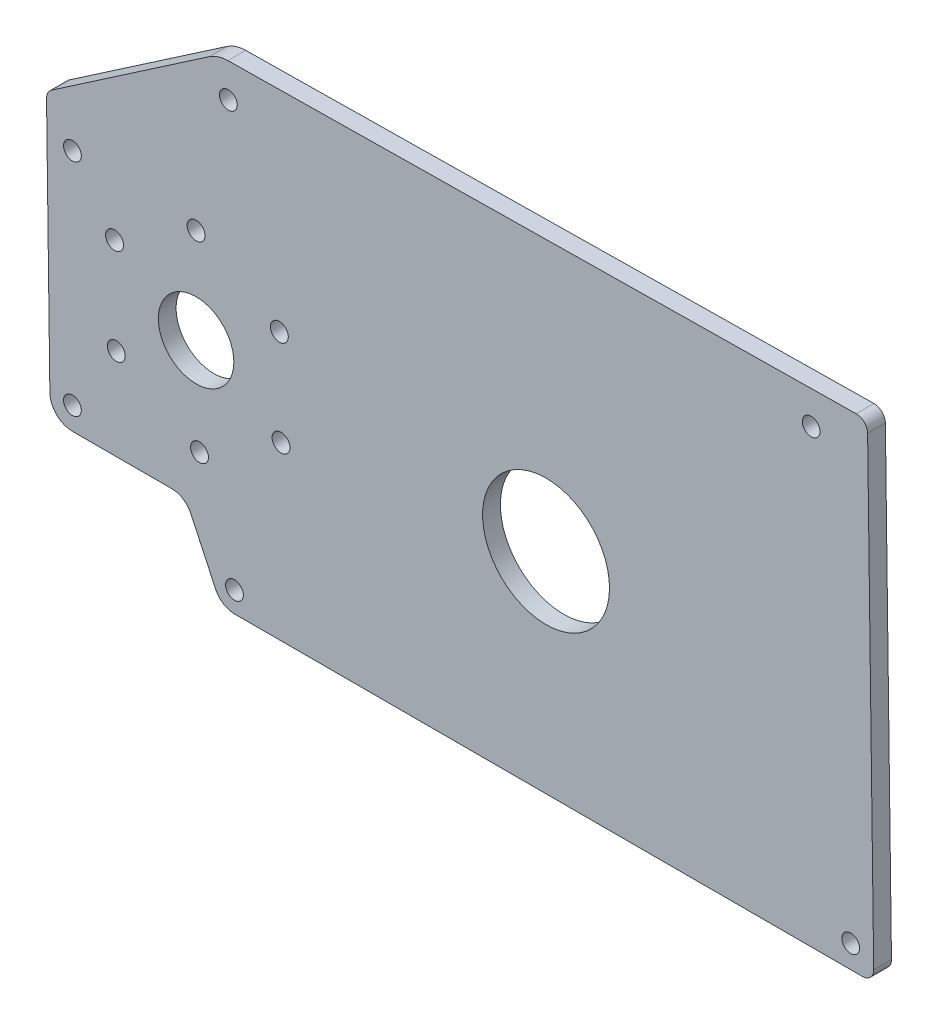
ISO-10303-21;
HEADER;
FILE_DESCRIPTION(('STEP AP214'),'2;1');
FILE_NAME('part.step','',(''),(''),'','','');
FILE_SCHEMA(('AUTOMOTIVE_DESIGN { 1 0 10303 214 1 1 1 1 }'));
ENDSEC;
DATA;
#1=APPLICATION_CONTEXT('core data for automotive mechanical design processes');
#2=APPLICATION_PROTOCOL_DEFINITION('international standard','automotive_design',2000,#1);
#3=PRODUCT_CONTEXT('',#1,'mechanical');
#4=PRODUCT('Part','Part','',(#3));
#5=PRODUCT_RELATED_PRODUCT_CATEGORY('part','',(#4));
#6=PRODUCT_DEFINITION_FORMATION('','',#4);
#7=PRODUCT_DEFINITION_CONTEXT('part definition',#1,'design');
#8=PRODUCT_DEFINITION('design','',#6,#7);
#9=PRODUCT_DEFINITION_SHAPE('','',#8);
#10=(LENGTH_UNIT() NAMED_UNIT(*) SI_UNIT(.MILLI.,.METRE.));
#11=(NAMED_UNIT(*) PLANE_ANGLE_UNIT() SI_UNIT($,.RADIAN.));
#12=(NAMED_UNIT(*) SI_UNIT($,.STERADIAN.) SOLID_ANGLE_UNIT());
#13=UNCERTAINTY_MEASURE_WITH_UNIT(LENGTH_MEASURE(1.E-05),#10,'distance_accuracy_value','');
#14=(GEOMETRIC_REPRESENTATION_CONTEXT(3) GLOBAL_UNCERTAINTY_ASSIGNED_CONTEXT((#13)) GLOBAL_UNIT_ASSIGNED_CONTEXT((#10,
#11,#12)) REPRESENTATION_CONTEXT('',''));
#15=CARTESIAN_POINT('',(0.,0.,0.));
#16=DIRECTION('',(0.,0.,1.));
#17=DIRECTION('',(1.,0.,0.));
#18=AXIS2_PLACEMENT_3D('',#15,#16,#17);
#19=CARTESIAN_POINT('',(30.2662459890792,33.6255082547779,4.));
#20=DIRECTION('',(0.,0.,1.));
#21=DIRECTION('',(1.,0.,0.));
#22=AXIS2_PLACEMENT_3D('',#19,#20,#21);
#23=PLANE('',#22);
#24=CARTESIAN_POINT('',(23.7634588187166,-38.3328881001896,4.));
#25=DIRECTION('',(0.,0.,1.));
#26=DIRECTION('',(1.,0.,0.));
#27=AXIS2_PLACEMENT_3D('',#24,#25,#26);
#28=CIRCLE('',#27,2.01929999999926);
#29=CARTESIAN_POINT('',(25.7827588187159,-38.3328881001896,4.));
#30=VERTEX_POINT('',#29);
#31=EDGE_CURVE('E344',#30,#30,#28,.T.);
#32=ORIENTED_EDGE('',*,*,#31,.F.);
#33=EDGE_LOOP('',(#32));
#34=FACE_BOUND('',#33,.T.);
#35=CARTESIAN_POINT('',(41.7380424022905,-5.86188853122968,4.));
#36=DIRECTION('',(0.,0.,1.));
#37=DIRECTION('',(1.,0.,0.));
#38=AXIS2_PLACEMENT_3D('',#35,#36,#37);
#39=CIRCLE('',#38,2.01929999999925);
#40=CARTESIAN_POINT('',(43.7573424022898,-5.86188853122968,4.));
#41=VERTEX_POINT('',#40);
#42=EDGE_CURVE('E332',#41,#41,#39,.T.);
#43=ORIENTED_EDGE('',*,*,#42,.F.);
#44=EDGE_LOOP('',(#43));
#45=FACE_BOUND('',#44,.T.);
#46=CARTESIAN_POINT('',(30.2662459890792,33.6255082547779,4.));
#47=DIRECTION('',(0.,0.,1.));
#48=DIRECTION('',(1.,0.,0.));
#49=AXIS2_PLACEMENT_3D('',#46,#47,#48);
#50=CIRCLE('',#49,1.99999999998389);
#51=CARTESIAN_POINT('',(32.2662459890631,33.6255082547779,4.));
#52=VERTEX_POINT('',#51);
#53=EDGE_CURVE('E320',#52,#52,#50,.T.);
#54=ORIENTED_EDGE('',*,*,#53,.F.);
#55=EDGE_LOOP('',(#54));
#56=FACE_BOUND('',#55,.T.);
#57=CARTESIAN_POINT('',(-4.85811183989235,-43.494222939777,4.));
#58=DIRECTION('',(0.,0.,1.));
#59=DIRECTION('',(1.,0.,0.));
#60=AXIS2_PLACEMENT_3D('',#57,#58,#59);
#61=CIRCLE('',#60,2.);
#62=CARTESIAN_POINT('',(-2.85811183989234,-43.494222939777,4.));
#63=VERTEX_POINT('',#62);
#64=EDGE_CURVE('E308',#63,#63,#61,.T.);
#65=ORIENTED_EDGE('',*,*,#64,.F.);
#66=EDGE_LOOP('',(#65));
#67=FACE_BOUND('',#66,.T.);
#68=CARTESIAN_POINT('',(-4.85811183989235,6.1453174279259,4.));
#69=DIRECTION('',(0.,0.,1.));
#70=DIRECTION('',(1.,0.,0.));
#71=AXIS2_PLACEMENT_3D('',#68,#69,#70);
#72=CIRCLE('',#71,2.);
#73=CARTESIAN_POINT('',(-2.85811183989235,6.1453174279259,4.));
#74=VERTEX_POINT('',#73);
#75=EDGE_CURVE('E296',#74,#74,#72,.T.);
#76=ORIENTED_EDGE('',*,*,#75,.F.);
#77=EDGE_LOOP('',(#76));
#78=FACE_BOUND('',#77,.T.);
#79=CARTESIAN_POINT('',(31.6332520207642,-61.2646579872688,4.));
#80=DIRECTION('',(0.,0.,1.));
#81=DIRECTION('',(1.,0.,0.));
#82=AXIS2_PLACEMENT_3D('',#79,#80,#81);
#83=CIRCLE('',#82,1.99999999999876);
#84=CARTESIAN_POINT('',(33.633252020763,-61.2646579872688,4.));
#85=VERTEX_POINT('',#84);
#86=EDGE_CURVE('E284',#85,#85,#83,.T.);
#87=ORIENTED_EDGE('',*,*,#86,.F.);
#88=EDGE_LOOP('',(#87));
#89=FACE_BOUND('',#88,.T.);
#90=CARTESIAN_POINT('',(101.811349412124,-18.6490529622797,4.));
#91=DIRECTION('',(0.,0.,1.));
#92=DIRECTION('',(1.,0.,0.));
#93=AXIS2_PLACEMENT_3D('',#90,#91,#92);
#94=CIRCLE('',#93,14.29);
#95=CARTESIAN_POINT('',(116.101349412124,-18.6490529622797,4.));
#96=VERTEX_POINT('',#95);
#97=EDGE_CURVE('E168',#96,#96,#94,.T.);
#98=ORIENTED_EDGE('',*,*,#97,.F.);
#99=EDGE_LOOP('',(#98));
#100=FACE_BOUND('',#99,.T.);
#101=DIRECTION('',(-0.825412157107729,-0.564530575698754,0.));
#102=VECTOR('',#101,1.);
#103=CARTESIAN_POINT('',(-6.61983482671686,17.6294748495068,4.));
#104=LINE('',#103,#102);
#105=CARTESIAN_POINT('',(25.9645230022547,39.9151488919387,4.));
#106=VERTEX_POINT('',#105);
#107=CARTESIAN_POINT('',(-9.58296343211521,15.6028791868787,4.));
#108=VERTEX_POINT('',#107);
#109=EDGE_CURVE('E49',#106,#108,#104,.T.);
#110=ORIENTED_EDGE('',*,*,#109,.T.);
#111=CARTESIAN_POINT('',(-8.14905576984035,13.5063323078251,4.));
#112=DIRECTION('',(0.,0.,1.));
#113=DIRECTION('',(-1.,0.,0.));
#114=AXIS2_PLACEMENT_3D('',#111,#112,#113);
#115=CIRCLE('',#114,2.54000000000003);
#116=CARTESIAN_POINT('',(-10.6888352442123,13.4728625967584,4.));
#117=VERTEX_POINT('',#116);
#118=EDGE_CURVE('E271',#108,#117,#115,.T.);
#119=ORIENTED_EDGE('',*,*,#118,.T.);
#120=DIRECTION('',(0.013177051601079,-0.999913178886598,0.));
#121=VECTOR('',#120,1.);
#122=CARTESIAN_POINT('',(-10.6888352442123,13.4728625967584,4.));
#123=LINE('',#122,#121);
#124=CARTESIAN_POINT('',(-9.93811183989234,-43.494222939777,4.));
#125=VERTEX_POINT('',#124);
#126=EDGE_CURVE('E225',#117,#125,#123,.T.);
#127=ORIENTED_EDGE('',*,*,#126,.T.);
#128=CARTESIAN_POINT('',(-4.85811183989235,-43.494222939777,4.));
#129=DIRECTION('',(0.,0.,1.));
#130=DIRECTION('',(-1.,0.,0.));
#131=AXIS2_PLACEMENT_3D('',#128,#129,#130);
#132=CIRCLE('',#131,5.07999999999999);
#133=CARTESIAN_POINT('',(-4.85811183989251,-48.574222939777,4.));
#134=VERTEX_POINT('',#133);
#135=EDGE_CURVE('E247',#125,#134,#132,.T.);
#136=ORIENTED_EDGE('',*,*,#135,.T.);
#137=DIRECTION('',(1.,0.,0.));
#138=VECTOR('',#137,1.);
#139=CARTESIAN_POINT('',(17.5661326864003,-48.574222939777,4.));
#140=LINE('',#139,#138);
#141=CARTESIAN_POINT('',(17.5661326864003,-48.574222939777,4.));
#142=VERTEX_POINT('',#141);
#143=EDGE_CURVE('E244',#134,#142,#140,.T.);
#144=ORIENTED_EDGE('',*,*,#143,.T.);
#145=CARTESIAN_POINT('',(17.5661326864003,-53.2486600238922,4.));
#146=DIRECTION('',(0.,0.,-1.));
#147=DIRECTION('',(1.,0.,0.));
#148=AXIS2_PLACEMENT_3D('',#145,#146,#147);
#149=CIRCLE('',#148,4.67443708411522);
#150=CARTESIAN_POINT('',(21.8007320590548,-51.2691322502892,4.));
#151=VERTEX_POINT('',#150);
#152=EDGE_CURVE('E246',#142,#151,#149,.T.);
#153=ORIENTED_EDGE('',*,*,#152,.T.);
#154=DIRECTION('',(0.423479391845908,-0.90590573719445,0.));
#155=VECTOR('',#154,1.);
#156=CARTESIAN_POINT('',(21.8007320590548,-51.2691322502892,4.));
#157=LINE('',#156,#155);
#158=CARTESIAN_POINT('',(27.3986526481097,-63.2441857608719,4.));
#159=VERTEX_POINT('',#158);
#160=EDGE_CURVE('E249',#151,#159,#157,.T.);
#161=ORIENTED_EDGE('',*,*,#160,.T.);
#162=CARTESIAN_POINT('',(31.6332520207642,-61.2646579872688,4.));
#163=DIRECTION('',(0.,0.,1.));
#164=DIRECTION('',(-1.,0.,0.));
#165=AXIS2_PLACEMENT_3D('',#162,#163,#164);
#166=CIRCLE('',#165,4.67443708411522);
#167=CARTESIAN_POINT('',(31.6332520207642,-65.9390950713841,4.));
#168=VERTEX_POINT('',#167);
#169=EDGE_CURVE('E255',#159,#168,#166,.T.);
#170=ORIENTED_EDGE('',*,*,#169,.T.);
#171=DIRECTION('',(1.,0.,0.));
#172=VECTOR('',#171,1.);
#173=CARTESIAN_POINT('',(31.6332520207642,-65.9390950713841,4.));
#174=LINE('',#173,#172);
#175=CARTESIAN_POINT('',(173.06117084053,-65.9390950713841,4.));
#176=VERTEX_POINT('',#175);
#177=EDGE_CURVE('E257',#168,#176,#174,.T.);
#178=ORIENTED_EDGE('',*,*,#177,.T.);
#179=CARTESIAN_POINT('',(173.06117084053,-63.3990950713841,4.));
#180=DIRECTION('',(0.,0.,1.));
#181=DIRECTION('',(1.,0.,0.));
#182=AXIS2_PLACEMENT_3D('',#179,#180,#181);
#183=CIRCLE('',#182,2.54);
#184=CARTESIAN_POINT('',(175.600950314902,-63.3656253603173,4.));
#185=VERTEX_POINT('',#184);
#186=EDGE_CURVE('E259',#176,#185,#183,.T.);
#187=ORIENTED_EDGE('',*,*,#186,.T.);
#188=DIRECTION('',(-0.0131770516010997,0.999913178886598,0.));
#189=VECTOR('',#188,1.);
#190=CARTESIAN_POINT('',(174.230829536448,40.6031428069102,4.));
#191=LINE('',#190,#189);
#192=CARTESIAN_POINT('',(174.230829536448,40.6031428069102,4.));
#193=VERTEX_POINT('',#192);
#194=EDGE_CURVE('E145',#185,#193,#191,.T.);
#195=ORIENTED_EDGE('',*,*,#194,.T.);
#196=CARTESIAN_POINT('',(171.691050062076,40.5696730958434,4.));
#197=DIRECTION('',(0.,0.,1.));
#198=DIRECTION('',(1.,0.,0.));
#199=AXIS2_PLACEMENT_3D('',#196,#197,#198);
#200=CIRCLE('',#199,2.53999999999998);
#201=CARTESIAN_POINT('',(171.657580351009,43.1094525702154,4.));
#202=VERTEX_POINT('',#201);
#203=EDGE_CURVE('E139',#193,#202,#200,.T.);
#204=ORIENTED_EDGE('',*,*,#203,.T.);
#205=DIRECTION('',(-0.999913178886598,-0.0131770516010794,0.));
#206=VECTOR('',#205,1.);
#207=CARTESIAN_POINT('',(30.1658368558789,41.2448466778937,4.));
#208=LINE('',#207,#206);
#209=CARTESIAN_POINT('',(30.1658368558789,41.2448466778937,4.));
#210=VERTEX_POINT('',#209);
#211=EDGE_CURVE('E143',#202,#210,#208,.T.);
#212=ORIENTED_EDGE('',*,*,#211,.T.);
#213=CARTESIAN_POINT('',(30.2662459890792,33.6255082547779,4.));
#214=DIRECTION('',(0.,0.,1.));
#215=DIRECTION('',(1.,0.,0.));
#216=AXIS2_PLACEMENT_3D('',#213,#214,#215);
#217=CIRCLE('',#216,7.61999999999999);
#218=EDGE_CURVE('E159',#210,#106,#217,.T.);
#219=ORIENTED_EDGE('',*,*,#218,.T.);
#220=EDGE_LOOP('',(#110,#119,#127,#136,#144,#153,#161,#170,#178,#187,#195,#204,#212,#219));
#221=FACE_BOUND('',#220,.T.);
#222=CARTESIAN_POINT('',(170.426367514816,-60.7757569411194,4.));
#223=DIRECTION('',(0.,0.,1.));
#224=DIRECTION('',(1.,0.,0.));
#225=AXIS2_PLACEMENT_3D('',#222,#223,#224);
#226=CIRCLE('',#225,2.);
#227=CARTESIAN_POINT('',(172.426367514816,-60.7757569411194,4.));
#228=VERTEX_POINT('',#227);
#229=EDGE_CURVE('E278',#228,#228,#226,.T.);
#230=ORIENTED_EDGE('',*,*,#229,.F.);
#231=EDGE_LOOP('',(#230));
#232=FACE_BOUND('',#231,.T.);
#233=CARTESIAN_POINT('',(161.513898191031,35.5525164901844,4.));
#234=DIRECTION('',(0.,0.,1.));
#235=DIRECTION('',(1.,0.,0.));
#236=AXIS2_PLACEMENT_3D('',#233,#234,#235);
#237=CIRCLE('',#236,2.);
#238=CARTESIAN_POINT('',(163.513898191031,35.5525164901844,4.));
#239=VERTEX_POINT('',#238);
#240=EDGE_CURVE('E290',#239,#239,#237,.T.);
#241=ORIENTED_EDGE('',*,*,#240,.F.);
#242=EDGE_LOOP('',(#241));
#243=FACE_BOUND('',#242,.T.);
#244=CARTESIAN_POINT('',(5.01631847672136,-27.9552574296417,4.));
#245=DIRECTION('',(0.,0.,1.));
#246=DIRECTION('',(1.,0.,0.));
#247=AXIS2_PLACEMENT_3D('',#244,#245,#246);
#248=CIRCLE('',#247,2.01929999999926);
#249=CARTESIAN_POINT('',(7.03561847672062,-27.9552574296417,4.));
#250=VERTEX_POINT('',#249);
#251=EDGE_CURVE('E302',#250,#250,#248,.T.);
#252=ORIENTED_EDGE('',*,*,#251,.F.);
#253=EDGE_LOOP('',(#252));
#254=FACE_BOUND('',#253,.T.);
#255=CARTESIAN_POINT('',(4.63004009751072,-6.53094230988786,4.));
#256=DIRECTION('',(0.,0.,1.));
#257=DIRECTION('',(1.,0.,0.));
#258=AXIS2_PLACEMENT_3D('',#255,#256,#257);
#259=CIRCLE('',#258,2.01929999999926);
#260=CARTESIAN_POINT('',(6.64934009750997,-6.53094230988786,4.));
#261=VERTEX_POINT('',#260);
#262=EDGE_CURVE('E314',#261,#261,#259,.T.);
#263=ORIENTED_EDGE('',*,*,#262,.F.);
#264=EDGE_LOOP('',(#263));
#265=FACE_BOUND('',#264,.T.);
#266=CARTESIAN_POINT('',(22.9909020602953,4.51574213931817,4.));
#267=DIRECTION('',(0.,0.,1.));
#268=DIRECTION('',(1.,0.,0.));
#269=AXIS2_PLACEMENT_3D('',#266,#267,#268);
#270=CIRCLE('',#269,2.01929999999926);
#271=CARTESIAN_POINT('',(25.0102020602946,4.51574213931817,4.));
#272=VERTEX_POINT('',#271);
#273=EDGE_CURVE('E326',#272,#272,#270,.T.);
#274=ORIENTED_EDGE('',*,*,#273,.F.);
#275=EDGE_LOOP('',(#274));
#276=FACE_BOUND('',#275,.T.);
#277=CARTESIAN_POINT('',(42.1243207815012,-27.2862036509835,4.));
#278=DIRECTION('',(0.,0.,1.));
#279=DIRECTION('',(1.,0.,0.));
#280=AXIS2_PLACEMENT_3D('',#277,#278,#279);
#281=CIRCLE('',#280,2.01929999999926);
#282=CARTESIAN_POINT('',(44.1436207815004,-27.2862036509835,4.));
#283=VERTEX_POINT('',#282);
#284=EDGE_CURVE('E338',#283,#283,#281,.T.);
#285=ORIENTED_EDGE('',*,*,#284,.F.);
#286=EDGE_LOOP('',(#285));
#287=FACE_BOUND('',#286,.T.);
#288=CARTESIAN_POINT('',(22.9909020602953,-16.8932969263444,4.));
#289=DIRECTION('',(0.,0.,1.));
#290=DIRECTION('',(1.,0.,0.));
#291=AXIS2_PLACEMENT_3D('',#288,#289,#290);
#292=CIRCLE('',#291,8.49999999999999);
#293=CARTESIAN_POINT('',(31.4909020602953,-16.8932969263444,4.));
#294=VERTEX_POINT('',#293);
#295=EDGE_CURVE('E350',#294,#294,#292,.T.);
#296=ORIENTED_EDGE('',*,*,#295,.F.);
#297=EDGE_LOOP('',(#296));
#298=FACE_BOUND('',#297,.T.);
#299=ADVANCED_FACE('F32',(#34,#45,#56,#67,#78,#89,#100,#221,#232,#243,#254,#265,#276,#287,#298),
#23,.T.);
#300=CARTESIAN_POINT('',(30.2662459890792,33.6255082547779,0.));
#301=DIRECTION('',(0.,0.,1.));
#302=DIRECTION('',(1.,0.,0.));
#303=AXIS2_PLACEMENT_3D('',#300,#301,#302);
#304=PLANE('',#303);
#305=CARTESIAN_POINT('',(-8.14905576984035,13.5063323078251,0.));
#306=DIRECTION('',(0.,0.,1.));
#307=DIRECTION('',(-1.,0.,0.));
#308=AXIS2_PLACEMENT_3D('',#305,#306,#307);
#309=CIRCLE('',#308,2.54000000000003);
#310=CARTESIAN_POINT('',(-9.58296343211521,15.6028791868787,0.));
#311=VERTEX_POINT('',#310);
#312=CARTESIAN_POINT('',(-10.6888352442123,13.4728625967584,0.));
#313=VERTEX_POINT('',#312);
#314=EDGE_CURVE('E165',#311,#313,#309,.T.);
#315=ORIENTED_EDGE('',*,*,#314,.F.);
#316=DIRECTION('',(-0.825412157107729,-0.564530575698754,0.));
#317=VECTOR('',#316,1.);
#318=CARTESIAN_POINT('',(16.768305703793,33.6255082547779,0.));
#319=LINE('',#318,#317);
#320=CARTESIAN_POINT('',(25.9645230022547,39.9151488919387,0.));
#321=VERTEX_POINT('',#320);
#322=EDGE_CURVE('E190',#321,#311,#319,.T.);
#323=ORIENTED_EDGE('',*,*,#322,.F.);
#324=CARTESIAN_POINT('',(30.2662459890792,33.6255082547779,0.));
#325=DIRECTION('',(0.,0.,1.));
#326=DIRECTION('',(1.,0.,0.));
#327=AXIS2_PLACEMENT_3D('',#324,#325,#326);
#328=CIRCLE('',#327,7.61999999999999);
#329=CARTESIAN_POINT('',(30.1658368558789,41.2448466778937,0.));
#330=VERTEX_POINT('',#329);
#331=EDGE_CURVE('E104',#330,#321,#328,.T.);
#332=ORIENTED_EDGE('',*,*,#331,.F.);
#333=DIRECTION('',(-0.999913178886598,-0.0131770516010794,0.));
#334=VECTOR('',#333,1.);
#335=CARTESIAN_POINT('',(30.1658368558789,41.2448466778937,0.));
#336=LINE('',#335,#334);
#337=CARTESIAN_POINT('',(171.657580351009,43.1094525702154,0.));
#338=VERTEX_POINT('',#337);
#339=EDGE_CURVE('E97',#338,#330,#336,.T.);
#340=ORIENTED_EDGE('',*,*,#339,.F.);
#341=CARTESIAN_POINT('',(171.691050062076,40.5696730958434,0.));
#342=DIRECTION('',(0.,0.,1.));
#343=DIRECTION('',(1.,0.,0.));
#344=AXIS2_PLACEMENT_3D('',#341,#342,#343);
#345=CIRCLE('',#344,2.53999999999998);
#346=CARTESIAN_POINT('',(174.230829536448,40.6031428069102,0.));
#347=VERTEX_POINT('',#346);
#348=EDGE_CURVE('E153',#347,#338,#345,.T.);
#349=ORIENTED_EDGE('',*,*,#348,.F.);
#350=DIRECTION('',(-0.0131770516010997,0.999913178886598,0.));
#351=VECTOR('',#350,1.);
#352=CARTESIAN_POINT('',(174.230829536448,40.6031428069102,0.));
#353=LINE('',#352,#351);
#354=CARTESIAN_POINT('',(175.600950314902,-63.3656253603173,0.));
#355=VERTEX_POINT('',#354);
#356=EDGE_CURVE('E185',#355,#347,#353,.T.);
#357=ORIENTED_EDGE('',*,*,#356,.F.);
#358=CARTESIAN_POINT('',(173.06117084053,-63.3990950713841,0.));
#359=DIRECTION('',(0.,0.,1.));
#360=DIRECTION('',(1.,0.,0.));
#361=AXIS2_PLACEMENT_3D('',#358,#359,#360);
#362=CIRCLE('',#361,2.54);
#363=CARTESIAN_POINT('',(173.06117084053,-65.9390950713841,0.));
#364=VERTEX_POINT('',#363);
#365=EDGE_CURVE('E183',#364,#355,#362,.T.);
#366=ORIENTED_EDGE('',*,*,#365,.F.);
#367=DIRECTION('',(1.,0.,0.));
#368=VECTOR('',#367,1.);
#369=CARTESIAN_POINT('',(66.5235655991573,-65.9390950713841,0.));
#370=LINE('',#369,#368);
#371=CARTESIAN_POINT('',(31.6332520207642,-65.9390950713841,0.));
#372=VERTEX_POINT('',#371);
#373=EDGE_CURVE('E181',#372,#364,#370,.T.);
#374=ORIENTED_EDGE('',*,*,#373,.F.);
#375=CARTESIAN_POINT('',(31.6332520207642,-61.2646579872688,0.));
#376=DIRECTION('',(0.,0.,1.));
#377=DIRECTION('',(-1.,0.,0.));
#378=AXIS2_PLACEMENT_3D('',#375,#376,#377);
#379=CIRCLE('',#378,4.67443708411522);
#380=CARTESIAN_POINT('',(27.3986526481097,-63.2441857608719,0.));
#381=VERTEX_POINT('',#380);
#382=EDGE_CURVE('E178',#381,#372,#379,.T.);
#383=ORIENTED_EDGE('',*,*,#382,.F.);
#384=DIRECTION('',(0.423479391845908,-0.90590573719445,0.));
#385=VECTOR('',#384,1.);
#386=CARTESIAN_POINT('',(21.8007320590548,-51.2691322502892,0.));
#387=LINE('',#386,#385);
#388=CARTESIAN_POINT('',(21.8007320590548,-51.2691322502892,0.));
#389=VERTEX_POINT('',#388);
#390=EDGE_CURVE('E176',#389,#381,#387,.T.);
#391=ORIENTED_EDGE('',*,*,#390,.F.);
#392=CARTESIAN_POINT('',(17.5661326864003,-53.2486600238922,0.));
#393=DIRECTION('',(0.,0.,-1.));
#394=DIRECTION('',(1.,0.,0.));
#395=AXIS2_PLACEMENT_3D('',#392,#393,#394);
#396=CIRCLE('',#395,4.67443708411522);
#397=CARTESIAN_POINT('',(17.5661326864003,-48.574222939777,0.));
#398=VERTEX_POINT('',#397);
#399=EDGE_CURVE('E174',#398,#389,#396,.T.);
#400=ORIENTED_EDGE('',*,*,#399,.F.);
#401=DIRECTION('',(1.,0.,0.));
#402=VECTOR('',#401,1.);
#403=CARTESIAN_POINT('',(17.5661326864003,-48.574222939777,0.));
#404=LINE('',#403,#402);
#405=CARTESIAN_POINT('',(-4.85811183989251,-48.574222939777,0.));
#406=VERTEX_POINT('',#405);
#407=EDGE_CURVE('E172',#406,#398,#404,.T.);
#408=ORIENTED_EDGE('',*,*,#407,.F.);
#409=CARTESIAN_POINT('',(-4.85811183989235,-43.494222939777,0.));
#410=DIRECTION('',(0.,0.,1.));
#411=DIRECTION('',(-1.,0.,0.));
#412=AXIS2_PLACEMENT_3D('',#409,#410,#411);
#413=CIRCLE('',#412,5.07999999999999);
#414=CARTESIAN_POINT('',(-9.93811183989234,-43.494222939777,0.));
#415=VERTEX_POINT('',#414);
#416=EDGE_CURVE('E170',#415,#406,#413,.T.);
#417=ORIENTED_EDGE('',*,*,#416,.F.);
#418=DIRECTION('',(0.013177051601079,-0.999913178886598,0.));
#419=VECTOR('',#418,1.);
#420=CARTESIAN_POINT('',(-10.6888352442123,13.4728625967584,0.));
#421=LINE('',#420,#419);
#422=EDGE_CURVE('E167',#313,#415,#421,.T.);
#423=ORIENTED_EDGE('',*,*,#422,.F.);
#424=EDGE_LOOP('',(#315,#323,#332,#340,#349,#357,#366,#374,#383,#391,#400,#408,#417,#423));
#425=FACE_BOUND('',#424,.T.);
#426=CARTESIAN_POINT('',(101.811349412124,-18.6490529622797,0.));
#427=DIRECTION('',(0.,0.,1.));
#428=DIRECTION('',(1.,0.,0.));
#429=AXIS2_PLACEMENT_3D('',#426,#427,#428);
#430=CIRCLE('',#429,14.29);
#431=CARTESIAN_POINT('',(116.101349412124,-18.6490529622797,0.));
#432=VERTEX_POINT('',#431);
#433=EDGE_CURVE('E275',#432,#432,#430,.T.);
#434=ORIENTED_EDGE('',*,*,#433,.T.);
#435=EDGE_LOOP('',(#434));
#436=FACE_BOUND('',#435,.T.);
#437=CARTESIAN_POINT('',(170.426367514816,-60.7757569411194,0.));
#438=DIRECTION('',(0.,0.,1.));
#439=DIRECTION('',(1.,0.,0.));
#440=AXIS2_PLACEMENT_3D('',#437,#438,#439);
#441=CIRCLE('',#440,2.);
#442=CARTESIAN_POINT('',(172.426367514816,-60.7757569411194,0.));
#443=VERTEX_POINT('',#442);
#444=EDGE_CURVE('E281',#443,#443,#441,.T.);
#445=ORIENTED_EDGE('',*,*,#444,.T.);
#446=EDGE_LOOP('',(#445));
#447=FACE_BOUND('',#446,.T.);
#448=CARTESIAN_POINT('',(31.6332520207642,-61.2646579872688,0.));
#449=DIRECTION('',(0.,0.,1.));
#450=DIRECTION('',(1.,0.,0.));
#451=AXIS2_PLACEMENT_3D('',#448,#449,#450);
#452=CIRCLE('',#451,1.99999999999876);
#453=CARTESIAN_POINT('',(33.633252020763,-61.2646579872688,0.));
#454=VERTEX_POINT('',#453);
#455=EDGE_CURVE('E287',#454,#454,#452,.T.);
#456=ORIENTED_EDGE('',*,*,#455,.T.);
#457=EDGE_LOOP('',(#456));
#458=FACE_BOUND('',#457,.T.);
#459=CARTESIAN_POINT('',(161.513898191031,35.5525164901844,0.));
#460=DIRECTION('',(0.,0.,1.));
#461=DIRECTION('',(1.,0.,0.));
#462=AXIS2_PLACEMENT_3D('',#459,#460,#461);
#463=CIRCLE('',#462,2.);
#464=CARTESIAN_POINT('',(163.513898191031,35.5525164901844,0.));
#465=VERTEX_POINT('',#464);
#466=EDGE_CURVE('E293',#465,#465,#463,.T.);
#467=ORIENTED_EDGE('',*,*,#466,.T.);
#468=EDGE_LOOP('',(#467));
#469=FACE_BOUND('',#468,.T.);
#470=CARTESIAN_POINT('',(-4.85811183989235,6.1453174279259,0.));
#471=DIRECTION('',(0.,0.,1.));
#472=DIRECTION('',(1.,0.,0.));
#473=AXIS2_PLACEMENT_3D('',#470,#471,#472);
#474=CIRCLE('',#473,2.);
#475=CARTESIAN_POINT('',(-2.85811183989235,6.1453174279259,0.));
#476=VERTEX_POINT('',#475);
#477=EDGE_CURVE('E299',#476,#476,#474,.T.);
#478=ORIENTED_EDGE('',*,*,#477,.T.);
#479=EDGE_LOOP('',(#478));
#480=FACE_BOUND('',#479,.T.);
#481=CARTESIAN_POINT('',(5.01631847672136,-27.9552574296417,0.));
#482=DIRECTION('',(0.,0.,1.));
#483=DIRECTION('',(1.,0.,0.));
#484=AXIS2_PLACEMENT_3D('',#481,#482,#483);
#485=CIRCLE('',#484,2.01929999999926);
#486=CARTESIAN_POINT('',(7.03561847672062,-27.9552574296417,0.));
#487=VERTEX_POINT('',#486);
#488=EDGE_CURVE('E305',#487,#487,#485,.T.);
#489=ORIENTED_EDGE('',*,*,#488,.T.);
#490=EDGE_LOOP('',(#489));
#491=FACE_BOUND('',#490,.T.);
#492=CARTESIAN_POINT('',(-4.85811183989235,-43.494222939777,0.));
#493=DIRECTION('',(0.,0.,1.));
#494=DIRECTION('',(1.,0.,0.));
#495=AXIS2_PLACEMENT_3D('',#492,#493,#494);
#496=CIRCLE('',#495,2.);
#497=CARTESIAN_POINT('',(-2.85811183989234,-43.494222939777,0.));
#498=VERTEX_POINT('',#497);
#499=EDGE_CURVE('E311',#498,#498,#496,.T.);
#500=ORIENTED_EDGE('',*,*,#499,.T.);
#501=EDGE_LOOP('',(#500));
#502=FACE_BOUND('',#501,.T.);
#503=CARTESIAN_POINT('',(4.63004009751072,-6.53094230988786,0.));
#504=DIRECTION('',(0.,0.,1.));
#505=DIRECTION('',(1.,0.,0.));
#506=AXIS2_PLACEMENT_3D('',#503,#504,#505);
#507=CIRCLE('',#506,2.01929999999926);
#508=CARTESIAN_POINT('',(6.64934009750997,-6.53094230988786,0.));
#509=VERTEX_POINT('',#508);
#510=EDGE_CURVE('E317',#509,#509,#507,.T.);
#511=ORIENTED_EDGE('',*,*,#510,.T.);
#512=EDGE_LOOP('',(#511));
#513=FACE_BOUND('',#512,.T.);
#514=CARTESIAN_POINT('',(30.2662459890792,33.6255082547779,0.));
#515=DIRECTION('',(0.,0.,1.));
#516=DIRECTION('',(1.,0.,0.));
#517=AXIS2_PLACEMENT_3D('',#514,#515,#516);
#518=CIRCLE('',#517,1.99999999998389);
#519=CARTESIAN_POINT('',(32.2662459890631,33.6255082547779,0.));
#520=VERTEX_POINT('',#519);
#521=EDGE_CURVE('E323',#520,#520,#518,.T.);
#522=ORIENTED_EDGE('',*,*,#521,.T.);
#523=EDGE_LOOP('',(#522));
#524=FACE_BOUND('',#523,.T.);
#525=CARTESIAN_POINT('',(22.9909020602953,4.51574213931817,0.));
#526=DIRECTION('',(0.,0.,1.));
#527=DIRECTION('',(1.,0.,0.));
#528=AXIS2_PLACEMENT_3D('',#525,#526,#527);
#529=CIRCLE('',#528,2.01929999999926);
#530=CARTESIAN_POINT('',(25.0102020602946,4.51574213931817,0.));
#531=VERTEX_POINT('',#530);
#532=EDGE_CURVE('E329',#531,#531,#529,.T.);
#533=ORIENTED_EDGE('',*,*,#532,.T.);
#534=EDGE_LOOP('',(#533));
#535=FACE_BOUND('',#534,.T.);
#536=CARTESIAN_POINT('',(41.7380424022905,-5.86188853122968,0.));
#537=DIRECTION('',(0.,0.,1.));
#538=DIRECTION('',(1.,0.,0.));
#539=AXIS2_PLACEMENT_3D('',#536,#537,#538);
#540=CIRCLE('',#539,2.01929999999925);
#541=CARTESIAN_POINT('',(43.7573424022898,-5.86188853122968,0.));
#542=VERTEX_POINT('',#541);
#543=EDGE_CURVE('E335',#542,#542,#540,.T.);
#544=ORIENTED_EDGE('',*,*,#543,.T.);
#545=EDGE_LOOP('',(#544));
#546=FACE_BOUND('',#545,.T.);
#547=CARTESIAN_POINT('',(42.1243207815012,-27.2862036509835,0.));
#548=DIRECTION('',(0.,0.,1.));
#549=DIRECTION('',(1.,0.,0.));
#550=AXIS2_PLACEMENT_3D('',#547,#548,#549);
#551=CIRCLE('',#550,2.01929999999926);
#552=CARTESIAN_POINT('',(44.1436207815004,-27.2862036509835,0.));
#553=VERTEX_POINT('',#552);
#554=EDGE_CURVE('E341',#553,#553,#551,.T.);
#555=ORIENTED_EDGE('',*,*,#554,.T.);
#556=EDGE_LOOP('',(#555));
#557=FACE_BOUND('',#556,.T.);
#558=CARTESIAN_POINT('',(23.7634588187166,-38.3328881001896,0.));
#559=DIRECTION('',(0.,0.,1.));
#560=DIRECTION('',(1.,0.,0.));
#561=AXIS2_PLACEMENT_3D('',#558,#559,#560);
#562=CIRCLE('',#561,2.01929999999926);
#563=CARTESIAN_POINT('',(25.7827588187159,-38.3328881001896,0.));
#564=VERTEX_POINT('',#563);
#565=EDGE_CURVE('E347',#564,#564,#562,.T.);
#566=ORIENTED_EDGE('',*,*,#565,.T.);
#567=EDGE_LOOP('',(#566));
#568=FACE_BOUND('',#567,.T.);
#569=CARTESIAN_POINT('',(22.9909020602953,-16.8932969263444,0.));
#570=DIRECTION('',(0.,0.,1.));
#571=DIRECTION('',(1.,0.,0.));
#572=AXIS2_PLACEMENT_3D('',#569,#570,#571);
#573=CIRCLE('',#572,8.49999999999999);
#574=CARTESIAN_POINT('',(31.4909020602953,-16.8932969263444,0.));
#575=VERTEX_POINT('',#574);
#576=EDGE_CURVE('E353',#575,#575,#573,.T.);
#577=ORIENTED_EDGE('',*,*,#576,.T.);
#578=EDGE_LOOP('',(#577));
#579=FACE_BOUND('',#578,.T.);
#580=ADVANCED_FACE('F231',(#425,#436,#447,#458,#469,#480,#491,#502,#513,#524,#535,#546,#557,
#568,#579),#304,.F.);
#581=CARTESIAN_POINT('',(-8.14905576984035,13.5063323078251,4.));
#582=DIRECTION('',(0.,0.,-1.));
#583=DIRECTION('',(-1.,0.,0.));
#584=AXIS2_PLACEMENT_3D('',#581,#582,#583);
#585=CYLINDRICAL_SURFACE('',#584,2.54000000000003);
#586=ORIENTED_EDGE('',*,*,#314,.T.);
#587=DIRECTION('',(0.,0.,-1.));
#588=VECTOR('',#587,1.);
#589=CARTESIAN_POINT('',(-10.6888352442123,13.4728625967584,4.));
#590=LINE('',#589,#588);
#591=EDGE_CURVE('E41',#117,#313,#590,.T.);
#592=ORIENTED_EDGE('',*,*,#591,.F.);
#593=ORIENTED_EDGE('',*,*,#118,.F.);
#594=DIRECTION('',(0.,0.,-1.));
#595=VECTOR('',#594,1.);
#596=CARTESIAN_POINT('',(-9.58296343211521,15.6028791868787,4.));
#597=LINE('',#596,#595);
#598=EDGE_CURVE('E11',#108,#311,#597,.T.);
#599=ORIENTED_EDGE('',*,*,#598,.T.);
#600=EDGE_LOOP('',(#586,#592,#593,#599));
#601=FACE_BOUND('',#600,.T.);
#602=ADVANCED_FACE('F34',(#601),#585,.T.);
#603=CARTESIAN_POINT('',(-10.6888352442123,13.4728625967584,4.));
#604=DIRECTION('',(0.999913178886599,0.013177051601079,0.));
#605=DIRECTION('',(-0.013177051601079,0.999913178886598,0.));
#606=AXIS2_PLACEMENT_3D('',#603,#604,#605);
#607=PLANE('',#606);
#608=ORIENTED_EDGE('',*,*,#422,.T.);
#609=DIRECTION('',(0.,0.,-1.));
#610=VECTOR('',#609,1.);
#611=CARTESIAN_POINT('',(-9.93811183989234,-43.494222939777,4.));
#612=LINE('',#611,#610);
#613=EDGE_CURVE('E216',#125,#415,#612,.T.);
#614=ORIENTED_EDGE('',*,*,#613,.F.);
#615=ORIENTED_EDGE('',*,*,#126,.F.);
#616=ORIENTED_EDGE('',*,*,#591,.T.);
#617=EDGE_LOOP('',(#608,#614,#615,#616));
#618=FACE_BOUND('',#617,.T.);
#619=ADVANCED_FACE('F223',(#618),#607,.F.);
#620=CARTESIAN_POINT('',(-4.85811183989235,-43.494222939777,4.));
#621=DIRECTION('',(0.,0.,-1.));
#622=DIRECTION('',(-1.,0.,0.));
#623=AXIS2_PLACEMENT_3D('',#620,#621,#622);
#624=CYLINDRICAL_SURFACE('',#623,5.07999999999999);
#625=ORIENTED_EDGE('',*,*,#416,.T.);
#626=DIRECTION('',(0.,0.,-1.));
#627=VECTOR('',#626,1.);
#628=CARTESIAN_POINT('',(-4.85811183989251,-48.574222939777,4.));
#629=LINE('',#628,#627);
#630=EDGE_CURVE('E213',#134,#406,#629,.T.);
#631=ORIENTED_EDGE('',*,*,#630,.F.);
#632=ORIENTED_EDGE('',*,*,#135,.F.);
#633=ORIENTED_EDGE('',*,*,#613,.T.);
#634=EDGE_LOOP('',(#625,#631,#632,#633));
#635=FACE_BOUND('',#634,.T.);
#636=ADVANCED_FACE('F238',(#635),#624,.T.);
#637=CARTESIAN_POINT('',(17.5661326864003,-48.574222939777,4.));
#638=DIRECTION('',(0.,1.,0.));
#639=DIRECTION('',(-1.,0.,0.));
#640=AXIS2_PLACEMENT_3D('',#637,#638,#639);
#641=PLANE('',#640);
#642=ORIENTED_EDGE('',*,*,#407,.T.);
#643=DIRECTION('',(0.,0.,-1.));
#644=VECTOR('',#643,1.);
#645=CARTESIAN_POINT('',(17.5661326864003,-48.574222939777,4.));
#646=LINE('',#645,#644);
#647=EDGE_CURVE('E210',#142,#398,#646,.T.);
#648=ORIENTED_EDGE('',*,*,#647,.F.);
#649=ORIENTED_EDGE('',*,*,#143,.F.);
#650=ORIENTED_EDGE('',*,*,#630,.T.);
#651=EDGE_LOOP('',(#642,#648,#649,#650));
#652=FACE_BOUND('',#651,.T.);
#653=ADVANCED_FACE('F242',(#652),#641,.F.);
#654=CARTESIAN_POINT('',(17.5661326864003,-53.2486600238922,4.));
#655=DIRECTION('',(0.,0.,-1.));
#656=DIRECTION('',(-1.,0.,0.));
#657=AXIS2_PLACEMENT_3D('',#654,#655,#656);
#658=CYLINDRICAL_SURFACE('',#657,4.67443708411522);
#659=ORIENTED_EDGE('',*,*,#399,.T.);
#660=DIRECTION('',(0.,0.,-1.));
#661=VECTOR('',#660,1.);
#662=CARTESIAN_POINT('',(21.8007320590548,-51.2691322502892,4.));
#663=LINE('',#662,#661);
#664=EDGE_CURVE('E207',#151,#389,#663,.T.);
#665=ORIENTED_EDGE('',*,*,#664,.F.);
#666=ORIENTED_EDGE('',*,*,#152,.F.);
#667=ORIENTED_EDGE('',*,*,#647,.T.);
#668=EDGE_LOOP('',(#659,#665,#666,#667));
#669=FACE_BOUND('',#668,.T.);
#670=ADVANCED_FACE('F399',(#669),#658,.F.);
#671=CARTESIAN_POINT('',(21.8007320590548,-51.2691322502892,4.));
#672=DIRECTION('',(0.90590573719445,0.423479391845908,0.));
#673=DIRECTION('',(-0.423479391845908,0.90590573719445,0.));
#674=AXIS2_PLACEMENT_3D('',#671,#672,#673);
#675=PLANE('',#674);
#676=ORIENTED_EDGE('',*,*,#390,.T.);
#677=DIRECTION('',(0.,0.,-1.));
#678=VECTOR('',#677,1.);
#679=CARTESIAN_POINT('',(27.3986526481097,-63.2441857608719,4.));
#680=LINE('',#679,#678);
#681=EDGE_CURVE('E204',#159,#381,#680,.T.);
#682=ORIENTED_EDGE('',*,*,#681,.F.);
#683=ORIENTED_EDGE('',*,*,#160,.F.);
#684=ORIENTED_EDGE('',*,*,#664,.T.);
#685=EDGE_LOOP('',(#676,#682,#683,#684));
#686=FACE_BOUND('',#685,.T.);
#687=ADVANCED_FACE('F395',(#686),#675,.F.);
#688=CARTESIAN_POINT('',(31.6332520207642,-61.2646579872688,4.));
#689=DIRECTION('',(0.,0.,-1.));
#690=DIRECTION('',(-1.,0.,0.));
#691=AXIS2_PLACEMENT_3D('',#688,#689,#690);
#692=CYLINDRICAL_SURFACE('',#691,4.67443708411522);
#693=ORIENTED_EDGE('',*,*,#382,.T.);
#694=DIRECTION('',(0.,0.,-1.));
#695=VECTOR('',#694,1.);
#696=CARTESIAN_POINT('',(31.6332520207642,-65.9390950713841,4.));
#697=LINE('',#696,#695);
#698=EDGE_CURVE('E201',#168,#372,#697,.T.);
#699=ORIENTED_EDGE('',*,*,#698,.F.);
#700=ORIENTED_EDGE('',*,*,#169,.F.);
#701=ORIENTED_EDGE('',*,*,#681,.T.);
#702=EDGE_LOOP('',(#693,#699,#700,#701));
#703=FACE_BOUND('',#702,.T.);
#704=ADVANCED_FACE('F391',(#703),#692,.T.);
#705=CARTESIAN_POINT('',(66.5235655991573,-65.9390950713841,4.));
#706=DIRECTION('',(0.,1.,0.));
#707=DIRECTION('',(-1.,0.,0.));
#708=AXIS2_PLACEMENT_3D('',#705,#706,#707);
#709=PLANE('',#708);
#710=ORIENTED_EDGE('',*,*,#373,.T.);
#711=DIRECTION('',(0.,0.,-1.));
#712=VECTOR('',#711,1.);
#713=CARTESIAN_POINT('',(173.06117084053,-65.9390950713841,4.));
#714=LINE('',#713,#712);
#715=EDGE_CURVE('E198',#176,#364,#714,.T.);
#716=ORIENTED_EDGE('',*,*,#715,.F.);
#717=ORIENTED_EDGE('',*,*,#177,.F.);
#718=ORIENTED_EDGE('',*,*,#698,.T.);
#719=EDGE_LOOP('',(#710,#716,#717,#718));
#720=FACE_BOUND('',#719,.T.);
#721=ADVANCED_FACE('F388',(#720),#709,.F.);
#722=CARTESIAN_POINT('',(173.06117084053,-63.3990950713841,4.));
#723=DIRECTION('',(0.,0.,-1.));
#724=DIRECTION('',(-1.,0.,0.));
#725=AXIS2_PLACEMENT_3D('',#722,#723,#724);
#726=CYLINDRICAL_SURFACE('',#725,2.54);
#727=ORIENTED_EDGE('',*,*,#365,.T.);
#728=DIRECTION('',(0.,0.,-1.));
#729=VECTOR('',#728,1.);
#730=CARTESIAN_POINT('',(175.600950314902,-63.3656253603173,4.));
#731=LINE('',#730,#729);
#732=EDGE_CURVE('E195',#185,#355,#731,.T.);
#733=ORIENTED_EDGE('',*,*,#732,.F.);
#734=ORIENTED_EDGE('',*,*,#186,.F.);
#735=ORIENTED_EDGE('',*,*,#715,.T.);
#736=EDGE_LOOP('',(#727,#733,#734,#735));
#737=FACE_BOUND('',#736,.T.);
#738=ADVANCED_FACE('F265',(#737),#726,.T.);
#739=CARTESIAN_POINT('',(174.230829536448,40.6031428069102,4.));
#740=DIRECTION('',(-0.999913178886598,-0.0131770516010996,0.));
#741=DIRECTION('',(0.0131770516010997,-0.999913178886598,0.));
#742=AXIS2_PLACEMENT_3D('',#739,#740,#741);
#743=PLANE('',#742);
#744=ORIENTED_EDGE('',*,*,#356,.T.);
#745=DIRECTION('',(0.,0.,-1.));
#746=VECTOR('',#745,1.);
#747=CARTESIAN_POINT('',(174.230829536448,40.6031428069102,4.));
#748=LINE('',#747,#746);
#749=EDGE_CURVE('E154',#193,#347,#748,.T.);
#750=ORIENTED_EDGE('',*,*,#749,.F.);
#751=ORIENTED_EDGE('',*,*,#194,.F.);
#752=ORIENTED_EDGE('',*,*,#732,.T.);
#753=EDGE_LOOP('',(#744,#750,#751,#752));
#754=FACE_BOUND('',#753,.T.);
#755=ADVANCED_FACE('F269',(#754),#743,.F.);
#756=CARTESIAN_POINT('',(171.691050062076,40.5696730958434,4.));
#757=DIRECTION('',(0.,0.,-1.));
#758=DIRECTION('',(-1.,0.,0.));
#759=AXIS2_PLACEMENT_3D('',#756,#757,#758);
#760=CYLINDRICAL_SURFACE('',#759,2.53999999999998);
#761=ORIENTED_EDGE('',*,*,#348,.T.);
#762=DIRECTION('',(0.,0.,-1.));
#763=VECTOR('',#762,1.);
#764=CARTESIAN_POINT('',(171.657580351009,43.1094525702154,4.));
#765=LINE('',#764,#763);
#766=EDGE_CURVE('E150',#202,#338,#765,.T.);
#767=ORIENTED_EDGE('',*,*,#766,.F.);
#768=ORIENTED_EDGE('',*,*,#203,.F.);
#769=ORIENTED_EDGE('',*,*,#749,.T.);
#770=EDGE_LOOP('',(#761,#767,#768,#769));
#771=FACE_BOUND('',#770,.T.);
#772=ADVANCED_FACE('F151',(#771),#760,.T.);
#773=CARTESIAN_POINT('',(30.1658368558789,41.2448466778937,4.));
#774=DIRECTION('',(0.0131770516010794,-0.999913178886598,0.));
#775=DIRECTION('',(0.999913178886598,0.0131770516010794,0.));
#776=AXIS2_PLACEMENT_3D('',#773,#774,#775);
#777=PLANE('',#776);
#778=ORIENTED_EDGE('',*,*,#339,.T.);
#779=DIRECTION('',(0.,0.,-1.));
#780=VECTOR('',#779,1.);
#781=CARTESIAN_POINT('',(30.1658368558789,41.2448466778937,4.));
#782=LINE('',#781,#780);
#783=EDGE_CURVE('E155',#210,#330,#782,.T.);
#784=ORIENTED_EDGE('',*,*,#783,.F.);
#785=ORIENTED_EDGE('',*,*,#211,.F.);
#786=ORIENTED_EDGE('',*,*,#766,.T.);
#787=EDGE_LOOP('',(#778,#784,#785,#786));
#788=FACE_BOUND('',#787,.T.);
#789=ADVANCED_FACE('F157',(#788),#777,.F.);
#790=CARTESIAN_POINT('',(30.2662459890792,33.6255082547779,4.));
#791=DIRECTION('',(0.,0.,-1.));
#792=DIRECTION('',(-1.,0.,0.));
#793=AXIS2_PLACEMENT_3D('',#790,#791,#792);
#794=CYLINDRICAL_SURFACE('',#793,7.61999999999999);
#795=ORIENTED_EDGE('',*,*,#331,.T.);
#796=DIRECTION('',(0.,0.,-1.));
#797=VECTOR('',#796,1.);
#798=CARTESIAN_POINT('',(25.9645230022547,39.9151488919387,4.));
#799=LINE('',#798,#797);
#800=EDGE_CURVE('E161',#106,#321,#799,.T.);
#801=ORIENTED_EDGE('',*,*,#800,.F.);
#802=ORIENTED_EDGE('',*,*,#218,.F.);
#803=ORIENTED_EDGE('',*,*,#783,.T.);
#804=EDGE_LOOP('',(#795,#801,#802,#803));
#805=FACE_BOUND('',#804,.T.);
#806=ADVANCED_FACE('F377',(#805),#794,.T.);
#807=CARTESIAN_POINT('',(16.768305703793,33.6255082547779,4.));
#808=DIRECTION('',(0.564530575698754,-0.825412157107729,0.));
#809=DIRECTION('',(0.825412157107729,0.564530575698754,0.));
#810=AXIS2_PLACEMENT_3D('',#807,#808,#809);
#811=PLANE('',#810);
#812=ORIENTED_EDGE('',*,*,#322,.T.);
#813=ORIENTED_EDGE('',*,*,#598,.F.);
#814=ORIENTED_EDGE('',*,*,#109,.F.);
#815=ORIENTED_EDGE('',*,*,#800,.T.);
#816=EDGE_LOOP('',(#812,#813,#814,#815));
#817=FACE_BOUND('',#816,.T.);
#818=ADVANCED_FACE('F270',(#817),#811,.F.);
#819=CARTESIAN_POINT('',(101.811349412124,-18.6490529622797,4.));
#820=DIRECTION('',(0.,0.,-1.));
#821=DIRECTION('',(-1.,0.,0.));
#822=AXIS2_PLACEMENT_3D('',#819,#820,#821);
#823=CYLINDRICAL_SURFACE('',#822,14.29);
#824=ORIENTED_EDGE('',*,*,#97,.T.);
#825=EDGE_LOOP('',(#824));
#826=FACE_BOUND('',#825,.T.);
#827=ORIENTED_EDGE('',*,*,#433,.F.);
#828=EDGE_LOOP('',(#827));
#829=FACE_BOUND('',#828,.T.);
#830=ADVANCED_FACE('F372',(#826,#829),#823,.F.);
#831=CARTESIAN_POINT('',(170.426367514816,-60.7757569411194,4.));
#832=DIRECTION('',(0.,0.,-1.));
#833=DIRECTION('',(-1.,0.,0.));
#834=AXIS2_PLACEMENT_3D('',#831,#832,#833);
#835=CYLINDRICAL_SURFACE('',#834,2.);
#836=ORIENTED_EDGE('',*,*,#229,.T.);
#837=EDGE_LOOP('',(#836));
#838=FACE_BOUND('',#837,.T.);
#839=ORIENTED_EDGE('',*,*,#444,.F.);
#840=EDGE_LOOP('',(#839));
#841=FACE_BOUND('',#840,.T.);
#842=ADVANCED_FACE('F506',(#838,#841),#835,.F.);
#843=CARTESIAN_POINT('',(31.6332520207642,-61.2646579872688,4.));
#844=DIRECTION('',(0.,0.,-1.));
#845=DIRECTION('',(-1.,0.,0.));
#846=AXIS2_PLACEMENT_3D('',#843,#844,#845);
#847=CYLINDRICAL_SURFACE('',#846,1.99999999999876);
#848=ORIENTED_EDGE('',*,*,#86,.T.);
#849=EDGE_LOOP('',(#848));
#850=FACE_BOUND('',#849,.T.);
#851=ORIENTED_EDGE('',*,*,#455,.F.);
#852=EDGE_LOOP('',(#851));
#853=FACE_BOUND('',#852,.T.);
#854=ADVANCED_FACE('F514',(#850,#853),#847,.F.);
#855=CARTESIAN_POINT('',(161.513898191031,35.5525164901844,4.));
#856=DIRECTION('',(0.,0.,-1.));
#857=DIRECTION('',(-1.,0.,0.));
#858=AXIS2_PLACEMENT_3D('',#855,#856,#857);
#859=CYLINDRICAL_SURFACE('',#858,2.);
#860=ORIENTED_EDGE('',*,*,#240,.T.);
#861=EDGE_LOOP('',(#860));
#862=FACE_BOUND('',#861,.T.);
#863=ORIENTED_EDGE('',*,*,#466,.F.);
#864=EDGE_LOOP('',(#863));
#865=FACE_BOUND('',#864,.T.);
#866=ADVANCED_FACE('F522',(#862,#865),#859,.F.);
#867=CARTESIAN_POINT('',(-4.85811183989235,6.1453174279259,4.));
#868=DIRECTION('',(0.,0.,-1.));
#869=DIRECTION('',(-1.,0.,0.));
#870=AXIS2_PLACEMENT_3D('',#867,#868,#869);
#871=CYLINDRICAL_SURFACE('',#870,2.);
#872=ORIENTED_EDGE('',*,*,#75,.T.);
#873=EDGE_LOOP('',(#872));
#874=FACE_BOUND('',#873,.T.);
#875=ORIENTED_EDGE('',*,*,#477,.F.);
#876=EDGE_LOOP('',(#875));
#877=FACE_BOUND('',#876,.T.);
#878=ADVANCED_FACE('F531',(#874,#877),#871,.F.);
#879=CARTESIAN_POINT('',(5.01631847672136,-27.9552574296417,4.));
#880=DIRECTION('',(0.,0.,-1.));
#881=DIRECTION('',(-1.,0.,0.));
#882=AXIS2_PLACEMENT_3D('',#879,#880,#881);
#883=CYLINDRICAL_SURFACE('',#882,2.01929999999926);
#884=ORIENTED_EDGE('',*,*,#251,.T.);
#885=EDGE_LOOP('',(#884));
#886=FACE_BOUND('',#885,.T.);
#887=ORIENTED_EDGE('',*,*,#488,.F.);
#888=EDGE_LOOP('',(#887));
#889=FACE_BOUND('',#888,.T.);
#890=ADVANCED_FACE('F540',(#886,#889),#883,.F.);
#891=CARTESIAN_POINT('',(-4.85811183989235,-43.494222939777,4.));
#892=DIRECTION('',(0.,0.,-1.));
#893=DIRECTION('',(-1.,0.,0.));
#894=AXIS2_PLACEMENT_3D('',#891,#892,#893);
#895=CYLINDRICAL_SURFACE('',#894,2.);
#896=ORIENTED_EDGE('',*,*,#64,.T.);
#897=EDGE_LOOP('',(#896));
#898=FACE_BOUND('',#897,.T.);
#899=ORIENTED_EDGE('',*,*,#499,.F.);
#900=EDGE_LOOP('',(#899));
#901=FACE_BOUND('',#900,.T.);
#902=ADVANCED_FACE('F549',(#898,#901),#895,.F.);
#903=CARTESIAN_POINT('',(4.63004009751072,-6.53094230988786,4.));
#904=DIRECTION('',(0.,0.,-1.));
#905=DIRECTION('',(-1.,0.,0.));
#906=AXIS2_PLACEMENT_3D('',#903,#904,#905);
#907=CYLINDRICAL_SURFACE('',#906,2.01929999999926);
#908=ORIENTED_EDGE('',*,*,#262,.T.);
#909=EDGE_LOOP('',(#908));
#910=FACE_BOUND('',#909,.T.);
#911=ORIENTED_EDGE('',*,*,#510,.F.);
#912=EDGE_LOOP('',(#911));
#913=FACE_BOUND('',#912,.T.);
#914=ADVANCED_FACE('F558',(#910,#913),#907,.F.);
#915=CARTESIAN_POINT('',(30.2662459890792,33.6255082547779,4.));
#916=DIRECTION('',(0.,0.,-1.));
#917=DIRECTION('',(-1.,0.,0.));
#918=AXIS2_PLACEMENT_3D('',#915,#916,#917);
#919=CYLINDRICAL_SURFACE('',#918,1.99999999998389);
#920=ORIENTED_EDGE('',*,*,#53,.T.);
#921=EDGE_LOOP('',(#920));
#922=FACE_BOUND('',#921,.T.);
#923=ORIENTED_EDGE('',*,*,#521,.F.);
#924=EDGE_LOOP('',(#923));
#925=FACE_BOUND('',#924,.T.);
#926=ADVANCED_FACE('F567',(#922,#925),#919,.F.);
#927=CARTESIAN_POINT('',(22.9909020602953,4.51574213931817,4.));
#928=DIRECTION('',(0.,0.,-1.));
#929=DIRECTION('',(-1.,0.,0.));
#930=AXIS2_PLACEMENT_3D('',#927,#928,#929);
#931=CYLINDRICAL_SURFACE('',#930,2.01929999999926);
#932=ORIENTED_EDGE('',*,*,#273,.T.);
#933=EDGE_LOOP('',(#932));
#934=FACE_BOUND('',#933,.T.);
#935=ORIENTED_EDGE('',*,*,#532,.F.);
#936=EDGE_LOOP('',(#935));
#937=FACE_BOUND('',#936,.T.);
#938=ADVANCED_FACE('F576',(#934,#937),#931,.F.);
#939=CARTESIAN_POINT('',(41.7380424022905,-5.86188853122968,4.));
#940=DIRECTION('',(0.,0.,-1.));
#941=DIRECTION('',(-1.,0.,0.));
#942=AXIS2_PLACEMENT_3D('',#939,#940,#941);
#943=CYLINDRICAL_SURFACE('',#942,2.01929999999925);
#944=ORIENTED_EDGE('',*,*,#42,.T.);
#945=EDGE_LOOP('',(#944));
#946=FACE_BOUND('',#945,.T.);
#947=ORIENTED_EDGE('',*,*,#543,.F.);
#948=EDGE_LOOP('',(#947));
#949=FACE_BOUND('',#948,.T.);
#950=ADVANCED_FACE('F585',(#946,#949),#943,.F.);
#951=CARTESIAN_POINT('',(42.1243207815012,-27.2862036509835,4.));
#952=DIRECTION('',(0.,0.,-1.));
#953=DIRECTION('',(-1.,0.,0.));
#954=AXIS2_PLACEMENT_3D('',#951,#952,#953);
#955=CYLINDRICAL_SURFACE('',#954,2.01929999999926);
#956=ORIENTED_EDGE('',*,*,#284,.T.);
#957=EDGE_LOOP('',(#956));
#958=FACE_BOUND('',#957,.T.);
#959=ORIENTED_EDGE('',*,*,#554,.F.);
#960=EDGE_LOOP('',(#959));
#961=FACE_BOUND('',#960,.T.);
#962=ADVANCED_FACE('F594',(#958,#961),#955,.F.);
#963=CARTESIAN_POINT('',(23.7634588187166,-38.3328881001896,4.));
#964=DIRECTION('',(0.,0.,-1.));
#965=DIRECTION('',(-1.,0.,0.));
#966=AXIS2_PLACEMENT_3D('',#963,#964,#965);
#967=CYLINDRICAL_SURFACE('',#966,2.01929999999926);
#968=ORIENTED_EDGE('',*,*,#31,.T.);
#969=EDGE_LOOP('',(#968));
#970=FACE_BOUND('',#969,.T.);
#971=ORIENTED_EDGE('',*,*,#565,.F.);
#972=EDGE_LOOP('',(#971));
#973=FACE_BOUND('',#972,.T.);
#974=ADVANCED_FACE('F603',(#970,#973),#967,.F.);
#975=CARTESIAN_POINT('',(22.9909020602953,-16.8932969263444,4.));
#976=DIRECTION('',(0.,0.,-1.));
#977=DIRECTION('',(-1.,0.,0.));
#978=AXIS2_PLACEMENT_3D('',#975,#976,#977);
#979=CYLINDRICAL_SURFACE('',#978,8.49999999999999);
#980=ORIENTED_EDGE('',*,*,#295,.T.);
#981=EDGE_LOOP('',(#980));
#982=FACE_BOUND('',#981,.T.);
#983=ORIENTED_EDGE('',*,*,#576,.F.);
#984=EDGE_LOOP('',(#983));
#985=FACE_BOUND('',#984,.T.);
#986=ADVANCED_FACE('F359',(#982,#985),#979,.F.);
#987=CLOSED_SHELL('',(#299,#580,#602,#619,#636,#653,#670,#687,#704,#721,#738,#755,#772,#789,
#806,#818,#830,#842,#854,#866,#878,#890,#902,#914,#926,#938,#950,#962,#974,#986));
#988=MANIFOLD_SOLID_BREP('B2',#987);
#989=ADVANCED_BREP_SHAPE_REPRESENTATION('',(#18,#988),#14);
#990=SHAPE_DEFINITION_REPRESENTATION(#9,#989);
ENDSEC;
END-ISO-10303-21;
